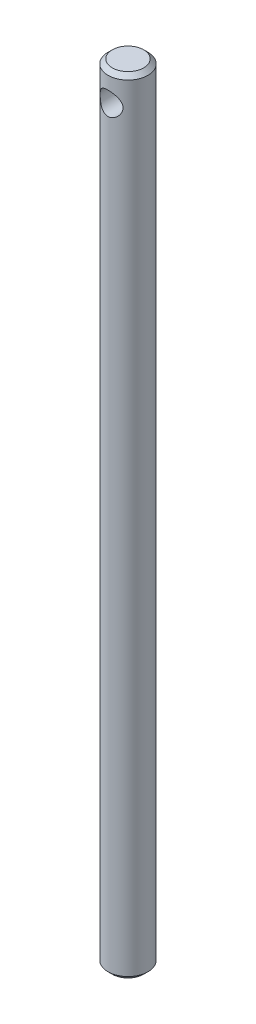
ISO-10303-21;
HEADER;
FILE_DESCRIPTION(('STEP AP214'),'2;1');
FILE_NAME('part.step','',(''),(''),'','','');
FILE_SCHEMA(('AUTOMOTIVE_DESIGN { 1 0 10303 214 1 1 1 1 }'));
ENDSEC;
DATA;
#1=APPLICATION_CONTEXT('core data for automotive mechanical design processes');
#2=APPLICATION_PROTOCOL_DEFINITION('international standard','automotive_design',2000,#1);
#3=PRODUCT_CONTEXT('',#1,'mechanical');
#4=PRODUCT('Part','Part','',(#3));
#5=PRODUCT_RELATED_PRODUCT_CATEGORY('part','',(#4));
#6=PRODUCT_DEFINITION_FORMATION('','',#4);
#7=PRODUCT_DEFINITION_CONTEXT('part definition',#1,'design');
#8=PRODUCT_DEFINITION('design','',#6,#7);
#9=PRODUCT_DEFINITION_SHAPE('','',#8);
#10=(LENGTH_UNIT() NAMED_UNIT(*) SI_UNIT(.MILLI.,.METRE.));
#11=(NAMED_UNIT(*) PLANE_ANGLE_UNIT() SI_UNIT($,.RADIAN.));
#12=(NAMED_UNIT(*) SI_UNIT($,.STERADIAN.) SOLID_ANGLE_UNIT());
#13=UNCERTAINTY_MEASURE_WITH_UNIT(LENGTH_MEASURE(1.E-05),#10,'distance_accuracy_value','');
#14=(GEOMETRIC_REPRESENTATION_CONTEXT(3) GLOBAL_UNCERTAINTY_ASSIGNED_CONTEXT((#13)) GLOBAL_UNIT_ASSIGNED_CONTEXT((#10,
#11,#12)) REPRESENTATION_CONTEXT('',''));
#15=CARTESIAN_POINT('',(0.,0.,0.));
#16=DIRECTION('',(0.,0.,1.));
#17=DIRECTION('',(1.,0.,0.));
#18=AXIS2_PLACEMENT_3D('',#15,#16,#17);
#19=CARTESIAN_POINT('',(0.,550.,0.));
#20=DIRECTION('',(0.,-1.,0.));
#21=DIRECTION('',(0.,0.,-1.));
#22=AXIS2_PLACEMENT_3D('',#19,#20,#21);
#23=CYLINDRICAL_SURFACE('',#22,14.);
#24=CARTESIAN_POINT('',(0.,2.99999999999989,0.));
#25=DIRECTION('',(0.,1.,0.));
#26=DIRECTION('',(0.,0.,1.));
#27=AXIS2_PLACEMENT_3D('',#24,#25,#26);
#28=CIRCLE('',#27,14.);
#29=CARTESIAN_POINT('',(0.,2.99999999999989,14.));
#30=VERTEX_POINT('',#29);
#31=EDGE_CURVE('E42',#30,#30,#28,.T.);
#32=ORIENTED_EDGE('',*,*,#31,.T.);
#33=EDGE_LOOP('',(#32));
#34=FACE_BOUND('',#33,.T.);
#35=CARTESIAN_POINT('',(0.,547.,0.));
#36=DIRECTION('',(0.,1.,0.));
#37=DIRECTION('',(0.,0.,1.));
#38=AXIS2_PLACEMENT_3D('',#35,#36,#37);
#39=CIRCLE('',#38,14.);
#40=CARTESIAN_POINT('',(0.,547.,14.));
#41=VERTEX_POINT('',#40);
#42=EDGE_CURVE('E46',#41,#41,#39,.F.);
#43=ORIENTED_EDGE('',*,*,#42,.T.);
#44=EDGE_LOOP('',(#43));
#45=FACE_BOUND('',#44,.T.);
#46=CARTESIAN_POINT('',(0.,538.,-14.));
#47=CARTESIAN_POINT('',(-0.206348569746244,537.999998224364,-13.9999983893369));
#48=CARTESIAN_POINT('',(-0.412761069135955,537.992003694596,-13.9954259145375));
#49=CARTESIAN_POINT('',(-0.824045281766807,537.960121872044,-13.9772448571329));
#50=CARTESIAN_POINT('',(-1.02891595067142,537.93622464309,-13.9636306251556));
#51=CARTESIAN_POINT('',(-1.43586653932047,537.87278694674,-13.9276735308067));
#52=CARTESIAN_POINT('',(-1.6379400732137,537.83321535363,-13.905313301992));
#53=CARTESIAN_POINT('',(-2.03750144563772,537.738911336563,-13.8524086804955));
#54=CARTESIAN_POINT('',(-2.23498729460728,537.684172463235,-13.8218608064758));
#55=CARTESIAN_POINT('',(-2.6229866271238,537.560501704796,-13.753492145078));
#56=CARTESIAN_POINT('',(-2.81353117234064,537.491645540415,-13.7157102275296));
#57=CARTESIAN_POINT('',(-3.1877160284108,537.340246855622,-13.6336047922152));
#58=CARTESIAN_POINT('',(-3.37135364765758,537.257699066052,-13.5892787567004));
#59=CARTESIAN_POINT('',(-3.73061544758125,537.079735676681,-13.4950716142418));
#60=CARTESIAN_POINT('',(-3.90624557455497,536.984329840522,-13.4451947272462));
#61=CARTESIAN_POINT('',(-4.24892051140751,536.781325470274,-13.3408700481529));
#62=CARTESIAN_POINT('',(-4.41596212781085,536.673722447872,-13.2864205753609));
#63=CARTESIAN_POINT('',(-4.9265397630214,536.317382826651,-13.1097143510966));
#64=CARTESIAN_POINT('',(-5.25367018791813,536.047861110048,-12.9810637749579));
#65=CARTESIAN_POINT('',(-5.86074380744032,535.46169153717,-12.7185432665506));
#66=CARTESIAN_POINT('',(-6.14063083614729,535.144988418745,-12.5846673515521));
#67=CARTESIAN_POINT('',(-6.53509669708748,534.620321118488,-12.3821492731101));
#68=CARTESIAN_POINT('',(-6.66779804940693,534.426714225919,-12.3109985176468));
#69=CARTESIAN_POINT('',(-6.91633609405209,534.027355774223,-12.1731044793822));
#70=CARTESIAN_POINT('',(-7.03217039063037,533.82160249568,-12.1063618234287));
#71=CARTESIAN_POINT('',(-7.24576794106188,533.399233817965,-11.9797436527425));
#72=CARTESIAN_POINT('',(-7.34355336123204,533.182632163477,-11.9198597493716));
#73=CARTESIAN_POINT('',(-7.52008119582336,532.739560655443,-11.8092862055513));
#74=CARTESIAN_POINT('',(-7.59882985768155,532.513094068219,-11.7585935501095));
#75=CARTESIAN_POINT('',(-7.72092307720129,532.102964335676,-11.6786738397758));
#76=CARTESIAN_POINT('',(-7.76824594055137,531.920918649878,-11.6471790362531));
#77=CARTESIAN_POINT('',(-7.85011626579967,531.552805864017,-11.5921574862299));
#78=CARTESIAN_POINT('',(-7.88466626907975,531.366739571729,-11.5686291547403));
#79=CARTESIAN_POINT('',(-7.94052951718446,530.991899518152,-11.5303573667282));
#80=CARTESIAN_POINT('',(-7.96185450866317,530.80312831235,-11.5156061147458));
#81=CARTESIAN_POINT('',(-7.99101531326784,530.424040968728,-11.4953900491863));
#82=CARTESIAN_POINT('',(-7.99885085729661,530.233724800166,-11.4899254208655));
#83=CARTESIAN_POINT('',(-8.00091560230418,529.852723479798,-11.4884877802072));
#84=CARTESIAN_POINT('',(-7.99512629376896,529.66203817808,-11.4925276798745));
#85=CARTESIAN_POINT('',(-7.96999020994449,529.282000164049,-11.5099733805068));
#86=CARTESIAN_POINT('',(-7.95064338105115,529.092647457008,-11.5233792185032));
#87=CARTESIAN_POINT('',(-7.89866004040776,528.716557923956,-11.5590725804429));
#88=CARTESIAN_POINT('',(-7.86601830613306,528.529822155786,-11.5813635946009));
#89=CARTESIAN_POINT('',(-7.78785800443762,528.160169314788,-11.6340656812816));
#90=CARTESIAN_POINT('',(-7.74233423228955,527.977253817606,-11.6644800355966));
#91=CARTESIAN_POINT('',(-7.63915938919789,527.617107222486,-11.7323072245279));
#92=CARTESIAN_POINT('',(-7.58156210593485,527.439854802287,-11.7696889401908));
#93=CARTESIAN_POINT('',(-7.45466636933572,527.090974030703,-11.8504684098295));
#94=CARTESIAN_POINT('',(-7.38536407182205,526.919347549179,-11.8938681394092));
#95=CARTESIAN_POINT('',(-7.16074505049567,526.413972773648,-12.0313994381436));
#96=CARTESIAN_POINT('',(-6.98866463449811,526.08955148929,-12.1328984847101));
#97=CARTESIAN_POINT('',(-6.57289990639237,525.420018360381,-12.3637369542547));
#98=CARTESIAN_POINT('',(-6.32216008287257,525.079922128336,-12.4949312891652));
#99=CARTESIAN_POINT('',(-5.90887064958309,524.602813305915,-12.6928615637109));
#100=CARTESIAN_POINT('',(-5.76479012076699,524.44918122891,-12.7590776838389));
#101=CARTESIAN_POINT('',(-5.46465971718862,524.153474504514,-12.8904731178086));
#102=CARTESIAN_POINT('',(-5.30860782292885,524.011401815488,-12.9556522544684));
#103=CARTESIAN_POINT('',(-4.96665948564026,523.724036803707,-13.0908307597392));
#104=CARTESIAN_POINT('',(-4.77939056313575,523.580232654495,-13.1605295244115));
#105=CARTESIAN_POINT('',(-4.39172346732932,523.309059223626,-13.2949173146522));
#106=CARTESIAN_POINT('',(-4.1913306672178,523.181683278563,-13.3596083671036));
#107=CARTESIAN_POINT('',(-3.77846083465486,522.944513225863,-13.482195287347));
#108=CARTESIAN_POINT('',(-3.56598639628002,522.834715363169,-13.5400926057196));
#109=CARTESIAN_POINT('',(-3.13027267458478,522.633935268624,-13.6474066257637));
#110=CARTESIAN_POINT('',(-2.90703473040872,522.542950703522,-13.6968243789527));
#111=CARTESIAN_POINT('',(-2.46720514786924,522.386620503896,-13.7825824848669));
#112=CARTESIAN_POINT('',(-2.25121893692879,522.319938318597,-13.8195902073993));
#113=CARTESIAN_POINT('',(-1.81300143325591,522.204852061382,-13.8838773153487));
#114=CARTESIAN_POINT('',(-1.59077036807656,522.156447324389,-13.9111570547441));
#115=CARTESIAN_POINT('',(-1.14215203932828,522.078682389119,-13.9551511892739));
#116=CARTESIAN_POINT('',(-0.915768346228856,522.049306552512,-13.971874259801));
#117=CARTESIAN_POINT('',(-0.460783322576202,522.010018885011,-13.9942678679201));
#118=CARTESIAN_POINT('',(-0.232182243142886,522.000104875334,-13.9999396427222));
#119=CARTESIAN_POINT('',(0.197229906606037,521.99990937937,-14.0000521596871));
#120=CARTESIAN_POINT('',(0.39804404929353,522.007389672019,-13.9957732994177));
#121=CARTESIAN_POINT('',(0.798179214814391,522.037390182127,-13.9786623499888));
#122=CARTESIAN_POINT('',(0.997500262461203,522.059910149081,-13.9658304032916));
#123=CARTESIAN_POINT('',(1.39318738006675,522.119703869548,-13.93192242029));
#124=CARTESIAN_POINT('',(1.5895535865009,522.156976939475,-13.9108467659595));
#125=CARTESIAN_POINT('',(1.97801220864612,522.245828623776,-13.8609460155288));
#126=CARTESIAN_POINT('',(2.17010449487689,522.29740767092,-13.832120684994));
#127=CARTESIAN_POINT('',(2.54683230514204,522.413690741554,-13.7677074219834));
#128=CARTESIAN_POINT('',(2.73152507655279,522.478250727227,-13.7321939543204));
#129=CARTESIAN_POINT('',(3.09459684324589,522.620195548232,-13.6549618566839));
#130=CARTESIAN_POINT('',(3.27297372583932,522.697584626667,-13.6132411742012));
#131=CARTESIAN_POINT('',(3.79723591135649,522.947994450514,-13.4800104831147));
#132=CARTESIAN_POINT('',(4.13251492744952,523.139339682791,-13.3803852294842));
#133=CARTESIAN_POINT('',(4.80208853511593,523.587585513523,-13.1558943893105));
#134=CARTESIAN_POINT('',(5.13264806996737,523.849236571404,-13.0294809534364));
#135=CARTESIAN_POINT('',(5.74791024502341,524.419887472119,-12.7700045191381));
#136=CARTESIAN_POINT('',(6.03255964351069,524.728941489338,-12.6369340314703));
#137=CARTESIAN_POINT('',(6.43570879052563,525.242257063991,-12.4341380070402));
#138=CARTESIAN_POINT('',(6.57188486739598,525.43216101906,-12.3625073010677));
#139=CARTESIAN_POINT('',(6.82772138189679,525.824238329347,-12.223068802736));
#140=CARTESIAN_POINT('',(6.94737945273445,526.026413436882,-12.1552615590457));
#141=CARTESIAN_POINT('',(7.16901974882874,526.441835529394,-12.0258731053623));
#142=CARTESIAN_POINT('',(7.27102088399648,526.65507034764,-11.9642852644564));
#143=CARTESIAN_POINT('',(7.4563968721249,527.091677197574,-11.8496427238659));
#144=CARTESIAN_POINT('',(7.53977744890774,527.315046088651,-11.7965854033706));
#145=CARTESIAN_POINT('',(7.67107664210837,527.721838451414,-11.711504014201));
#146=CARTESIAN_POINT('',(7.72276573651977,527.903619071309,-11.6774075139255));
#147=CARTESIAN_POINT('',(7.81335379108548,528.271594656097,-11.616990740506));
#148=CARTESIAN_POINT('',(7.85225531313917,528.457788728763,-11.5906689098694));
#149=CARTESIAN_POINT('',(7.9167594859756,528.833305163515,-11.5467071785352));
#150=CARTESIAN_POINT('',(7.94237461939792,529.02262441626,-11.5290591295899));
#151=CARTESIAN_POINT('',(7.98000413423074,529.403255249739,-11.5030457424611));
#152=CARTESIAN_POINT('',(7.99201830544329,529.594566861218,-11.4946805477408));
#153=CARTESIAN_POINT('',(8.00227476171062,529.978128295651,-11.4875427843935));
#154=CARTESIAN_POINT('',(8.00048910694232,530.170379234014,-11.4887896768698));
#155=CARTESIAN_POINT('',(7.98310713049137,530.553948950389,-11.5008743339446));
#156=CARTESIAN_POINT('',(7.9675107577593,530.745267724953,-11.5117121339946));
#157=CARTESIAN_POINT('',(7.92272696763971,531.125653183175,-11.5425791156925));
#158=CARTESIAN_POINT('',(7.89353221121622,531.314718594114,-11.5626132605151));
#159=CARTESIAN_POINT('',(7.82194996487676,531.689215488588,-11.6111568250217));
#160=CARTESIAN_POINT('',(7.7795622442734,531.87464690852,-11.6396663929035));
#161=CARTESIAN_POINT('',(7.68296440427168,532.237564271559,-11.7036468022726));
#162=CARTESIAN_POINT('',(7.62897591746768,532.415132661254,-11.7389860379718));
#163=CARTESIAN_POINT('',(7.5092894017524,532.764917834745,-11.8159056646947));
#164=CARTESIAN_POINT('',(7.44358736500501,532.937132763074,-11.8574881911132));
#165=CARTESIAN_POINT('',(7.22974900883271,533.444623057435,-11.9899488282758));
#166=CARTESIAN_POINT('',(7.06482957785753,533.7709324008,-12.0885751818032));
#167=CARTESIAN_POINT('',(6.66567889515723,534.443462660542,-12.3137638338276));
#168=CARTESIAN_POINT('',(6.42468511104124,534.785012332883,-12.4422892793399));
#169=CARTESIAN_POINT('',(6.02639848400661,535.265539546352,-12.6374254088518));
#170=CARTESIAN_POINT('',(5.88738664013632,535.420519019265,-12.7029116349465));
#171=CARTESIAN_POINT('',(5.59751359756213,535.719367269414,-12.833279673105));
#172=CARTESIAN_POINT('',(5.44665053210793,535.863234289161,-12.8981613881412));
#173=CARTESIAN_POINT('',(5.11411257857662,536.156373127636,-13.0338791890993));
#174=CARTESIAN_POINT('',(4.93094253741423,536.304076664456,-13.104447151505));
#175=CARTESIAN_POINT('',(4.55126649914855,536.583425490783,-13.2410972877079));
#176=CARTESIAN_POINT('',(4.35476536218306,536.715076584109,-13.3071810789177));
#177=CARTESIAN_POINT('',(3.94939436102825,536.961214261972,-13.4330681963335));
#178=CARTESIAN_POINT('',(3.74052570585976,537.075702520458,-13.4928721348636));
#179=CARTESIAN_POINT('',(3.31169159857951,537.286269179442,-13.6044751727899));
#180=CARTESIAN_POINT('',(3.0917292248676,537.382352651967,-13.6562764768047));
#181=CARTESIAN_POINT('',(2.68225390669621,537.539542134938,-13.7419492722299));
#182=CARTESIAN_POINT('',(2.49428044302461,537.603829662522,-13.7773711005117));
#183=CARTESIAN_POINT('',(2.1129540556424,537.718487077475,-13.8409813174507));
#184=CARTESIAN_POINT('',(1.91960209008935,537.768859426517,-13.8691709854551));
#185=CARTESIAN_POINT('',(1.5292083769049,537.855023143731,-13.9176191594726));
#186=CARTESIAN_POINT('',(1.33217688633407,537.890850107497,-13.9378970225214));
#187=CARTESIAN_POINT('',(0.935388501281416,537.947651944459,-13.9701331346864));
#188=CARTESIAN_POINT('',(0.735633223408041,537.968635267252,-13.982096116899));
#189=CARTESIAN_POINT('',(0.446226919295384,537.988044536859,-13.9931711159956));
#190=CARTESIAN_POINT('',(0.357068890537316,537.992525962839,-13.9957302433796));
#191=CARTESIAN_POINT('',(0.178611242464193,537.998504235222,-13.9991451232899));
#192=CARTESIAN_POINT('',(0.0893116092789582,538.000000768529,-14.0000006971258));
#193=CARTESIAN_POINT('',(0.,538.,-14.));
#194=B_SPLINE_CURVE_WITH_KNOTS('',3,(#46,#47,#48,#49,#50,#51,#52,#53,#54,#55,#56,#57,#58,#59,
#60,#61,#62,#63,#64,#65,#66,#67,#68,#69,#70,#71,#72,#73,#74,#75,#76,#77,#78,#79,#80,#81,#82,#83,
#84,#85,#86,#87,#88,#89,#90,#91,#92,#93,#94,#95,#96,#97,#98,#99,#100,#101,#102,#103,#104,#105,
#106,#107,#108,#109,#110,#111,#112,#113,#114,#115,#116,#117,#118,#119,#120,#121,#122,#123,#124,
#125,#126,#127,#128,#129,#130,#131,#132,#133,#134,#135,#136,#137,#138,#139,#140,#141,#142,#143,
#144,#145,#146,#147,#148,#149,#150,#151,#152,#153,#154,#155,#156,#157,#158,#159,#160,#161,#162,
#163,#164,#165,#166,#167,#168,#169,#170,#171,#172,#173,#174,#175,#176,#177,#178,#179,#180,#181,
#182,#183,#184,#185,#186,#187,#188,#189,#190,#191,#192,#193),.UNSPECIFIED.,.T.,.F.,(4,2,2,2,2,2,
2,2,2,2,2,2,2,2,2,2,2,2,2,2,2,2,2,2,2,2,2,2,2,2,2,2,2,2,2,2,2,2,2,2,2,2,2,2,2,2,2,2,2,2,2,2,2,2,
2,2,2,2,2,2,2,2,2,2,2,2,2,2,2,2,2,2,2,4),(0.,0.618952648092796,1.23829238771076,
1.85886821065711,2.47970831849197,3.09730168442685,3.71513328214306,4.33249835081751,
4.95009133909342,6.27331436113893,7.59809960000251,8.3331184150078,9.06824152832021,
9.80245572078913,10.5364286325235,11.1079866723981,11.6794309296137,12.2503668917707,
12.8213142432367,13.3930376806808,13.9647633786336,14.5367138796694,15.1088957965127,
15.6785808406987,16.2484533467746,17.3876388887967,18.7093804994482,19.3712344355034,
20.0332002689087,20.7708303910484,21.5081603774566,22.2453326434878,22.9824134295208,
23.6685994551746,24.3547605095832,25.0403569452953,25.7258766229929,26.3281366023786,
26.9303865506231,27.5326085968026,28.1348488627904,28.7307427636312,29.3268341455113,
30.5181900190599,31.8335529640759,33.1504305268649,33.8829267780671,34.6155278767511,
35.3473394668916,36.0789257929607,36.6544565618714,37.2298719569023,37.8047457621251,
38.3796284516935,38.9556753821993,39.5317244419928,40.1080847558403,40.684455148282,
41.2506628806031,41.8170647161799,42.9492792354632,44.2558389693987,44.9100916153669,
45.5644475236629,46.3005113583637,47.0363082724252,47.7720333750069,48.507555432349,
49.1123054560148,49.716948427365,50.3201026602578,50.9229132766567,51.190779730085,
51.4586742792773),.UNSPECIFIED.);
#195=CARTESIAN_POINT('',(0.,538.,-14.));
#196=VERTEX_POINT('',#195);
#197=EDGE_CURVE('E51',#196,#196,#194,.T.);
#198=ORIENTED_EDGE('',*,*,#197,.T.);
#199=EDGE_LOOP('',(#198));
#200=FACE_BOUND('',#199,.T.);
#201=CARTESIAN_POINT('',(8.,530.,11.4891252930761));
#202=CARTESIAN_POINT('',(7.99999935787318,529.796467946592,11.489126205359));
#203=CARTESIAN_POINT('',(7.99222093739566,529.592926763103,11.494553805695));
#204=CARTESIAN_POINT('',(7.96123805270269,529.187587176047,11.5160338937242));
#205=CARTESIAN_POINT('',(7.93803253042836,528.985788892978,11.5320871101689));
#206=CARTESIAN_POINT('',(7.87655003429312,528.585429863575,11.5741669846632));
#207=CARTESIAN_POINT('',(7.83826277504619,528.386871423179,11.6002004486793));
#208=CARTESIAN_POINT('',(7.74715252449393,527.994450647354,11.6612446903438));
#209=CARTESIAN_POINT('',(7.69432282300342,527.800590524866,11.6962596117137));
#210=CARTESIAN_POINT('',(7.57521099426554,527.420148141422,11.7737497061029));
#211=CARTESIAN_POINT('',(7.50902563226831,527.233524431491,11.8161709362434));
#212=CARTESIAN_POINT('',(7.36362364874681,526.866958352895,11.9073259259037));
#213=CARTESIAN_POINT('',(7.28440218569753,526.68701849712,11.9560620292922));
#214=CARTESIAN_POINT('',(7.11357880853858,526.334576005232,12.058478218016));
#215=CARTESIAN_POINT('',(7.02197688460668,526.162073375019,12.1121583072737));
#216=CARTESIAN_POINT('',(6.82702919645338,525.825122461031,12.2231048014585));
#217=CARTESIAN_POINT('',(6.72368303206901,525.660674451977,12.280371328557));
#218=CARTESIAN_POINT('',(6.37278986898851,525.144872846215,12.4684628836801));
#219=CARTESIAN_POINT('',(6.10292894790172,524.809843087986,12.6039221101815));
#220=CARTESIAN_POINT('',(5.66068633058362,524.342901250429,12.8055879429556));
#221=CARTESIAN_POINT('',(5.50691703469404,524.193101189047,12.8725995223909));
#222=CARTESIAN_POINT('',(5.18728463853355,523.905888326322,13.0046887929451));
#223=CARTESIAN_POINT('',(5.02141944098823,523.768477682424,13.0697661459275));
#224=CARTESIAN_POINT('',(4.66194414007323,523.494454562713,13.2025153488387));
#225=CARTESIAN_POINT('',(4.46719629801404,523.359165766518,13.269843547386));
#226=CARTESIAN_POINT('',(4.06509696496217,523.105695826404,13.3984892031923));
#227=CARTESIAN_POINT('',(3.85775108894336,522.987507139203,13.4598093068935));
#228=CARTESIAN_POINT('',(3.43166945278213,522.769447252386,13.5746936142742));
#229=CARTESIAN_POINT('',(3.2129379453207,522.669569275626,13.628260685947));
#230=CARTESIAN_POINT('',(2.76555609989001,522.489352294608,13.7260371292073));
#231=CARTESIAN_POINT('',(2.53690721463523,522.409010439977,13.7702478657862));
#232=CARTESIAN_POINT('',(2.09214757578943,522.275235857725,13.844463501064));
#233=CARTESIAN_POINT('',(1.87671473758835,522.220052429283,13.8753785928248));
#234=CARTESIAN_POINT('',(1.44085379358996,522.127671728449,13.9273863603767));
#235=CARTESIAN_POINT('',(1.2204259574686,522.090473487462,13.948479565125));
#236=CARTESIAN_POINT('',(0.776637541640443,522.034648956507,13.9802106559346));
#237=CARTESIAN_POINT('',(0.553279104804067,522.016009787628,13.9908557922715));
#238=CARTESIAN_POINT('',(0.105540206763929,521.997559806652,14.0013923689171));
#239=CARTESIAN_POINT('',(-0.118840162518487,521.997747333309,14.0012847580366));
#240=CARTESIAN_POINT('',(-0.54120483719161,522.015852920796,13.9909458354256));
#241=CARTESIAN_POINT('',(-0.739307140595291,522.031765296803,13.981859727482));
#242=CARTESIAN_POINT('',(-1.13324065436716,522.078188612779,13.9554551892339));
#243=CARTESIAN_POINT('',(-1.32907186265502,522.108699566121,13.9381367513891));
#244=CARTESIAN_POINT('',(-1.71710436673406,522.183951504672,13.8956702176371));
#245=CARTESIAN_POINT('',(-1.90930571233539,522.228692294465,13.8705222292524));
#246=CARTESIAN_POINT('',(-2.28886889231523,522.331899362289,13.8129625584278));
#247=CARTESIAN_POINT('',(-2.4762305329974,522.390366188726,13.7805505857671));
#248=CARTESIAN_POINT('',(-2.8466367631275,522.520992837365,13.708848937922));
#249=CARTESIAN_POINT('',(-3.02963027125488,522.593266258983,13.6695024300594));
#250=CARTESIAN_POINT('',(-3.38869989028845,522.750505100388,13.5849474447185));
#251=CARTESIAN_POINT('',(-3.56477365967581,522.835474770445,13.5397370048669));
#252=CARTESIAN_POINT('',(-4.08133031913792,523.108394886479,13.3966451618644));
#253=CARTESIAN_POINT('',(-4.41038459232621,523.314440586023,13.291255790185));
#254=CARTESIAN_POINT('',(-5.06776505827324,523.794995139369,13.0557768217318));
#255=CARTESIAN_POINT('',(-5.39180398545102,524.07461029329,12.9242417778685));
#256=CARTESIAN_POINT('',(-5.9911815102104,524.681385033515,12.6575416058976));
#257=CARTESIAN_POINT('',(-6.26646020813502,525.008602210645,12.5223722446662));
#258=CARTESIAN_POINT('',(-6.6510318099346,525.548131940427,12.3202140745588));
#259=CARTESIAN_POINT('',(-6.77929998321677,525.745946347992,12.2498990677733));
#260=CARTESIAN_POINT('',(-7.01858679330551,526.153540057659,12.114384638017));
#261=CARTESIAN_POINT('',(-7.12960303865946,526.363321013056,12.049185924883));
#262=CARTESIAN_POINT('',(-7.33310792125625,526.793434743503,11.9264265110216));
#263=CARTESIAN_POINT('',(-7.42562347538946,527.01375160241,11.8688547555418));
#264=CARTESIAN_POINT('',(-7.59114644102661,527.463873789337,11.7636783561548));
#265=CARTESIAN_POINT('',(-7.66416067300526,527.69367576744,11.7160702287904));
#266=CARTESIAN_POINT('',(-7.77516436521672,528.107479605767,11.6426014717043));
#267=CARTESIAN_POINT('',(-7.81734535237599,528.289926345187,11.6142572762409));
#268=CARTESIAN_POINT('',(-7.88893043075296,528.658369043997,11.5657535313694));
#269=CARTESIAN_POINT('',(-7.91833702734712,528.844364299957,11.5455923771137));
#270=CARTESIAN_POINT('',(-7.96397245724536,529.218564338989,11.5141614253525));
#271=CARTESIAN_POINT('',(-7.98021174944459,529.40676724771,11.5028845711787));
#272=CARTESIAN_POINT('',(-7.99932030628692,529.784186845225,11.4896045348875));
#273=CARTESIAN_POINT('',(-8.00218923023241,529.973403559728,11.4876015890837));
#274=CARTESIAN_POINT('',(-7.99451086101233,530.351536747348,11.4929464067712));
#275=CARTESIAN_POINT('',(-7.98395601753631,530.540452991604,11.5002994326084));
#276=CARTESIAN_POINT('',(-7.94957218731956,530.91648864934,11.5240936962739));
#277=CARTESIAN_POINT('',(-7.92574315125816,531.103608056143,11.5405349678698));
#278=CARTESIAN_POINT('',(-7.8651260959167,531.474850481056,11.5819313455294));
#279=CARTESIAN_POINT('',(-7.82833257116855,531.658972191365,11.6068900684511));
#280=CARTESIAN_POINT('',(-7.74222786397824,532.023098930557,11.6645011177748));
#281=CARTESIAN_POINT('',(-7.692911632558,532.203102266983,11.6971565469978));
#282=CARTESIAN_POINT('',(-7.58162634041819,532.560141869278,11.7695963220345));
#283=CARTESIAN_POINT('',(-7.51951208171773,532.737116313668,11.8094617700244));
#284=CARTESIAN_POINT('',(-7.38356659760328,533.085103700357,11.89493119581));
#285=CARTESIAN_POINT('',(-7.30973150719436,533.256114653403,11.9405370655036));
#286=CARTESIAN_POINT('',(-7.07149845059386,533.759196630134,12.0842173417178));
#287=CARTESIAN_POINT('',(-6.89032049811611,534.081482238583,12.1891898336968));
#288=CARTESIAN_POINT('',(-6.45360047243492,534.74708039356,12.4266823079105));
#289=CARTESIAN_POINT('',(-6.19070291613536,535.084980772152,12.5608806999762));
#290=CARTESIAN_POINT('',(-5.75872693500327,535.557219235379,12.7617574258965));
#291=CARTESIAN_POINT('',(-5.60833747142709,535.708963302039,12.8286958092816));
#292=CARTESIAN_POINT('',(-5.29545640963493,536.000318443351,12.9609780736424));
#293=CARTESIAN_POINT('',(-5.13296281627238,536.139927509515,13.0263216893825));
#294=CARTESIAN_POINT('',(-4.77965918089527,536.419546559258,13.1603209238306));
#295=CARTESIAN_POINT('',(-4.58764366412851,536.55819250171,13.2286514542014));
#296=CARTESIAN_POINT('',(-4.19078930808755,536.818620069743,13.3596752056301));
#297=CARTESIAN_POINT('',(-3.98595600979651,536.940408910322,13.4223708344247));
#298=CARTESIAN_POINT('',(-3.56462133850408,537.165929442952,13.5403586587357));
#299=CARTESIAN_POINT('',(-3.34812405783038,537.26966741484,13.5956534274358));
#300=CARTESIAN_POINT('',(-2.90486806319719,537.457860875428,13.6972044211313));
#301=CARTESIAN_POINT('',(-2.67811077283266,537.542319029466,13.7434618953599));
#302=CARTESIAN_POINT('',(-2.23495150027957,537.684703271257,13.8221359016709));
#303=CARTESIAN_POINT('',(-2.01920900667976,537.744229417212,13.8553725686741));
#304=CARTESIAN_POINT('',(-1.58225574682195,537.845172483779,13.9120445173834));
#305=CARTESIAN_POINT('',(-1.36104524050138,537.886590263482,13.9354802640585));
#306=CARTESIAN_POINT('',(-0.915231256113425,537.950662192655,13.9718407363616));
#307=CARTESIAN_POINT('',(-0.690630402021844,537.97333016452,13.9847732048989));
#308=CARTESIAN_POINT('',(-0.239962292564529,537.999584323436,13.9997581872884));
#309=CARTESIAN_POINT('',(-0.0138951821201306,538.003172368371,14.0018117604599));
#310=CARTESIAN_POINT('',(0.411213692102603,537.991915195321,13.9953813703653));
#311=CARTESIAN_POINT('',(0.610333417578036,537.979170298392,13.988098040945));
#312=CARTESIAN_POINT('',(1.00659085045522,537.93891865448,13.9651764704906));
#313=CARTESIAN_POINT('',(1.20372856914467,537.911411991617,13.9495382770656));
#314=CARTESIAN_POINT('',(1.59462422714654,537.841975632371,13.9102754631077));
#315=CARTESIAN_POINT('',(1.78838225509186,537.800046314825,13.8866510523468));
#316=CARTESIAN_POINT('',(2.17126841657198,537.702249210644,13.8319558130634));
#317=CARTESIAN_POINT('',(2.36039638058599,537.646380914497,13.8008847123429));
#318=CARTESIAN_POINT('',(2.73316739886822,537.521203206738,13.7319249529037));
#319=CARTESIAN_POINT('',(2.91680257013087,537.451875455324,13.6940269970792));
#320=CARTESIAN_POINT('',(3.27738544473097,537.300481470461,13.612236659385));
#321=CARTESIAN_POINT('',(3.45433089419798,537.218410990521,13.5683422798058));
#322=CARTESIAN_POINT('',(3.97380675992928,536.954107841711,13.4289644423869));
#323=CARTESIAN_POINT('',(4.30522274065978,536.753699904513,13.3257390030004));
#324=CARTESIAN_POINT('',(4.96733530069177,536.285530109561,13.0943490998098));
#325=CARTESIAN_POINT('',(5.29395096324952,536.012786898998,12.9646906254431));
#326=CARTESIAN_POINT('',(5.89958284052395,535.41983313755,12.7005543738491));
#327=CARTESIAN_POINT('',(6.17854141763053,535.099565972218,12.5660709956994));
#328=CARTESIAN_POINT('',(6.57042581834878,534.56996211836,12.363425415178));
#329=CARTESIAN_POINT('',(6.70181247889653,534.375068304132,12.2924998675349));
#330=CARTESIAN_POINT('',(6.94760836068747,533.973183652657,12.1552671212315));
#331=CARTESIAN_POINT('',(7.06201516193777,533.76619109693,12.0889605815919));
#332=CARTESIAN_POINT('',(7.27261222633215,533.34144266603,11.9634500588359));
#333=CARTESIAN_POINT('',(7.36882687861767,533.123701701946,11.9042366060546));
#334=CARTESIAN_POINT('',(7.54207213091632,532.678460891517,11.795237875964));
#335=CARTESIAN_POINT('',(7.61910923894089,532.450964386578,11.7454494016113));
#336=CARTESIAN_POINT('',(7.73744636878654,532.041169004413,11.6677208755722));
#337=CARTESIAN_POINT('',(7.78289066379248,531.860510507767,11.6373895195056));
#338=CARTESIAN_POINT('',(7.86121615302251,531.495368201456,11.5846242156915));
#339=CARTESIAN_POINT('',(7.89409981314862,531.310885150132,11.5621887178982));
#340=CARTESIAN_POINT('',(7.94687101669036,530.939368878357,11.5259823478464));
#341=CARTESIAN_POINT('',(7.96676875048651,530.752337775378,11.5122046818872));
#342=CARTESIAN_POINT('',(7.99333404464276,530.376873794355,11.4937753836699));
#343=CARTESIAN_POINT('',(8.0000005945152,530.188440810349,11.489124448436));
#344=CARTESIAN_POINT('',(8.,530.,11.4891252930761));
#345=B_SPLINE_CURVE_WITH_KNOTS('',3,(#201,#202,#203,#204,#205,#206,#207,#208,#209,#210,#211,
#212,#213,#214,#215,#216,#217,#218,#219,#220,#221,#222,#223,#224,#225,#226,#227,#228,#229,#230,
#231,#232,#233,#234,#235,#236,#237,#238,#239,#240,#241,#242,#243,#244,#245,#246,#247,#248,#249,
#250,#251,#252,#253,#254,#255,#256,#257,#258,#259,#260,#261,#262,#263,#264,#265,#266,#267,#268,
#269,#270,#271,#272,#273,#274,#275,#276,#277,#278,#279,#280,#281,#282,#283,#284,#285,#286,#287,
#288,#289,#290,#291,#292,#293,#294,#295,#296,#297,#298,#299,#300,#301,#302,#303,#304,#305,#306,
#307,#308,#309,#310,#311,#312,#313,#314,#315,#316,#317,#318,#319,#320,#321,#322,#323,#324,#325,
#326,#327,#328,#329,#330,#331,#332,#333,#334,#335,#336,#337,#338,#339,#340,#341,#342,#343,#344),
.UNSPECIFIED.,.T.,.F.,(4,2,2,2,2,2,2,2,2,2,2,2,2,2,2,2,2,2,2,2,2,2,2,2,2,2,2,2,2,2,2,2,2,2,2,2,
2,2,2,2,2,2,2,2,2,2,2,2,2,2,2,2,2,2,2,2,2,2,2,2,2,2,2,2,2,2,2,2,2,2,2,4),(0.,0.610394126103337,
1.22083012005517,1.8316831395968,2.44281849325877,3.0496754854296,3.65675837123255,
4.26384173867711,4.87094579755479,6.21753747554206,6.89171864533113,7.56601698870426,
8.30456692832726,9.04279007542038,9.78073943799213,10.5185810671458,11.1912108386204,
11.8638043814644,12.5359308577257,13.2079980263196,13.8041314389816,14.4002653976618,
14.9963911700471,15.5925407639334,16.1938249441429,16.795310866662,17.9975256071593,
19.335643409798,20.675393796061,21.4126763910495,22.1500610967486,22.8863650392052,
23.6224111253971,24.1899980120178,24.7574735303865,25.324497855629,25.8915366294474,
26.4588944800693,27.0262544387397,27.5938556220513,28.1616860185037,28.7363534334688,
29.3112107426537,30.4603992702763,31.800643383429,32.4717642760115,33.1429960365516,
33.8815468318411,34.6197805364184,35.3577568961569,36.0956311724703,36.7734445402102,
37.4512257479103,38.1285068475322,38.8057219965162,39.4039821689449,40.0022389322991,
40.6004799826191,41.1987429037137,41.7978268107278,42.3971107915819,43.5948947440243,
44.9242990162926,46.2552998910707,46.9910662175935,47.7269373060545,48.4618147498756,
49.1964424677425,49.7620901204454,50.3276266681387,50.8927188898655,51.4578542669703),.UNSPECIFIED.);
#346=CARTESIAN_POINT('',(8.,530.,11.4891252930761));
#347=VERTEX_POINT('',#346);
#348=EDGE_CURVE('E59',#347,#347,#345,.T.);
#349=ORIENTED_EDGE('',*,*,#348,.T.);
#350=EDGE_LOOP('',(#349));
#351=FACE_BOUND('',#350,.T.);
#352=ADVANCED_FACE('F31',(#34,#45,#200,#351),#23,.T.);
#353=CARTESIAN_POINT('',(0.,550.,0.));
#354=DIRECTION('',(0.,1.,0.));
#355=DIRECTION('',(0.,0.,1.));
#356=AXIS2_PLACEMENT_3D('',#353,#354,#355);
#357=PLANE('',#356);
#358=CARTESIAN_POINT('',(0.,550.,0.));
#359=DIRECTION('',(0.,1.,0.));
#360=DIRECTION('',(0.,0.,1.));
#361=AXIS2_PLACEMENT_3D('',#358,#359,#360);
#362=CIRCLE('',#361,11.);
#363=CARTESIAN_POINT('',(0.,550.,11.));
#364=VERTEX_POINT('',#363);
#365=EDGE_CURVE('E10',#364,#364,#362,.T.);
#366=ORIENTED_EDGE('',*,*,#365,.T.);
#367=EDGE_LOOP('',(#366));
#368=FACE_BOUND('',#367,.T.);
#369=ADVANCED_FACE('F72',(#368),#357,.T.);
#370=CARTESIAN_POINT('',(0.,0.,0.));
#371=DIRECTION('',(0.,1.,0.));
#372=DIRECTION('',(0.,0.,1.));
#373=AXIS2_PLACEMENT_3D('',#370,#371,#372);
#374=PLANE('',#373);
#375=CARTESIAN_POINT('',(0.,0.,0.));
#376=DIRECTION('',(0.,1.,0.));
#377=DIRECTION('',(0.,0.,1.));
#378=AXIS2_PLACEMENT_3D('',#375,#376,#377);
#379=CIRCLE('',#378,11.0000000000001);
#380=CARTESIAN_POINT('',(0.,0.,11.0000000000001));
#381=VERTEX_POINT('',#380);
#382=EDGE_CURVE('E38',#381,#381,#379,.F.);
#383=ORIENTED_EDGE('',*,*,#382,.T.);
#384=EDGE_LOOP('',(#383));
#385=FACE_BOUND('',#384,.T.);
#386=ADVANCED_FACE('F70',(#385),#374,.F.);
#387=CARTESIAN_POINT('',(0.,530.,-14.));
#388=DIRECTION('',(0.,0.,1.));
#389=DIRECTION('',(1.,0.,0.));
#390=AXIS2_PLACEMENT_3D('',#387,#388,#389);
#391=CYLINDRICAL_SURFACE('',#390,8.);
#392=ORIENTED_EDGE('',*,*,#348,.F.);
#393=EDGE_LOOP('',(#392));
#394=FACE_BOUND('',#393,.T.);
#395=ORIENTED_EDGE('',*,*,#197,.F.);
#396=EDGE_LOOP('',(#395));
#397=FACE_BOUND('',#396,.T.);
#398=ADVANCED_FACE('F65',(#394,#397),#391,.F.);
#399=CARTESIAN_POINT('',(0.,2.99999999999989,0.));
#400=DIRECTION('',(0.,1.,0.));
#401=DIRECTION('',(0.,0.,1.));
#402=AXIS2_PLACEMENT_3D('',#399,#400,#401);
#403=CONICAL_SURFACE('',#402,14.,0.785398163397446);
#404=ORIENTED_EDGE('',*,*,#382,.F.);
#405=EDGE_LOOP('',(#404));
#406=FACE_BOUND('',#405,.T.);
#407=ORIENTED_EDGE('',*,*,#31,.F.);
#408=EDGE_LOOP('',(#407));
#409=FACE_BOUND('',#408,.T.);
#410=ADVANCED_FACE('F69',(#406,#409),#403,.T.);
#411=CARTESIAN_POINT('',(0.,550.,0.));
#412=DIRECTION('',(0.,-1.,0.));
#413=DIRECTION('',(0.,0.,-1.));
#414=AXIS2_PLACEMENT_3D('',#411,#412,#413);
#415=CONICAL_SURFACE('',#414,11.,0.785398163397465);
#416=ORIENTED_EDGE('',*,*,#42,.F.);
#417=EDGE_LOOP('',(#416));
#418=FACE_BOUND('',#417,.T.);
#419=ORIENTED_EDGE('',*,*,#365,.F.);
#420=EDGE_LOOP('',(#419));
#421=FACE_BOUND('',#420,.T.);
#422=ADVANCED_FACE('F33',(#418,#421),#415,.T.);
#423=CLOSED_SHELL('',(#352,#369,#386,#398,#410,#422));
#424=MANIFOLD_SOLID_BREP('B2',#423);
#425=ADVANCED_BREP_SHAPE_REPRESENTATION('',(#18,#424),#14);
#426=SHAPE_DEFINITION_REPRESENTATION(#9,#425);
ENDSEC;
END-ISO-10303-21;
